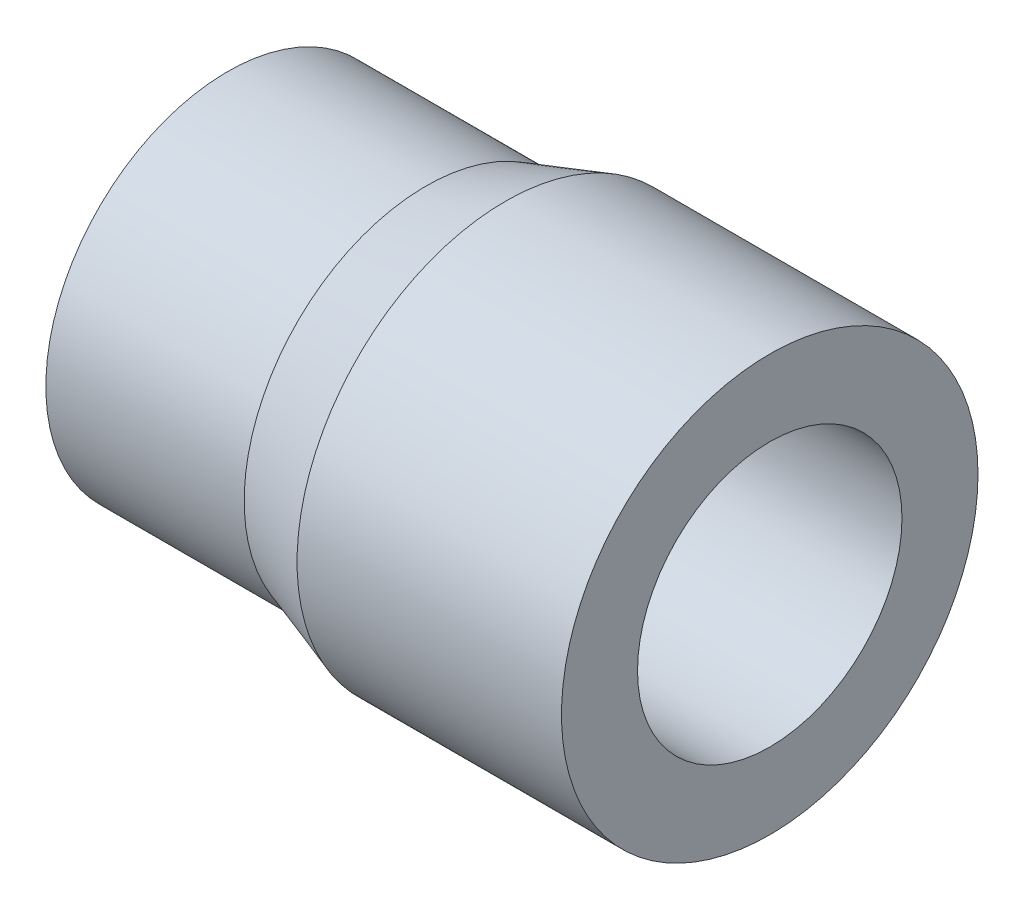
ISO-10303-21;
HEADER;
FILE_DESCRIPTION(('STEP AP214'),'2;1');
FILE_NAME('part.step','',(''),(''),'','','');
FILE_SCHEMA(('AUTOMOTIVE_DESIGN { 1 0 10303 214 1 1 1 1 }'));
ENDSEC;
DATA;
#1=APPLICATION_CONTEXT('core data for automotive mechanical design processes');
#2=APPLICATION_PROTOCOL_DEFINITION('international standard','automotive_design',2000,#1);
#3=PRODUCT_CONTEXT('',#1,'mechanical');
#4=PRODUCT('Part','Part','',(#3));
#5=PRODUCT_RELATED_PRODUCT_CATEGORY('part','',(#4));
#6=PRODUCT_DEFINITION_FORMATION('','',#4);
#7=PRODUCT_DEFINITION_CONTEXT('part definition',#1,'design');
#8=PRODUCT_DEFINITION('design','',#6,#7);
#9=PRODUCT_DEFINITION_SHAPE('','',#8);
#10=(LENGTH_UNIT() NAMED_UNIT(*) SI_UNIT(.MILLI.,.METRE.));
#11=(NAMED_UNIT(*) PLANE_ANGLE_UNIT() SI_UNIT($,.RADIAN.));
#12=(NAMED_UNIT(*) SI_UNIT($,.STERADIAN.) SOLID_ANGLE_UNIT());
#13=UNCERTAINTY_MEASURE_WITH_UNIT(LENGTH_MEASURE(1.E-05),#10,'distance_accuracy_value','');
#14=(GEOMETRIC_REPRESENTATION_CONTEXT(3) GLOBAL_UNCERTAINTY_ASSIGNED_CONTEXT((#13)) GLOBAL_UNIT_ASSIGNED_CONTEXT((#10,
#11,#12)) REPRESENTATION_CONTEXT('',''));
#15=CARTESIAN_POINT('',(0.,0.,0.));
#16=DIRECTION('',(0.,0.,1.));
#17=DIRECTION('',(1.,0.,0.));
#18=AXIS2_PLACEMENT_3D('',#15,#16,#17);
#19=CARTESIAN_POINT('',(0.,0.,0.));
#20=DIRECTION('',(1.,0.,0.));
#21=DIRECTION('',(0.,0.,-1.));
#22=AXIS2_PLACEMENT_3D('',#19,#20,#21);
#23=CYLINDRICAL_SURFACE('',#22,3.15);
#24=CARTESIAN_POINT('',(0.,0.,0.));
#25=DIRECTION('',(1.,0.,0.));
#26=DIRECTION('',(0.,0.,-1.));
#27=AXIS2_PLACEMENT_3D('',#24,#25,#26);
#28=CIRCLE('',#27,3.15);
#29=CARTESIAN_POINT('',(0.,0.,-3.15));
#30=VERTEX_POINT('',#29);
#31=EDGE_CURVE('E10',#30,#30,#28,.T.);
#32=ORIENTED_EDGE('',*,*,#31,.F.);
#33=EDGE_LOOP('',(#32));
#34=FACE_BOUND('',#33,.T.);
#35=CARTESIAN_POINT('',(-4.,0.,0.));
#36=DIRECTION('',(1.,0.,0.));
#37=DIRECTION('',(0.,0.,-1.));
#38=AXIS2_PLACEMENT_3D('',#35,#36,#37);
#39=CIRCLE('',#38,3.15);
#40=CARTESIAN_POINT('',(-4.,0.,-3.15));
#41=VERTEX_POINT('',#40);
#42=EDGE_CURVE('E59',#41,#41,#39,.T.);
#43=ORIENTED_EDGE('',*,*,#42,.T.);
#44=EDGE_LOOP('',(#43));
#45=FACE_BOUND('',#44,.T.);
#46=ADVANCED_FACE('F37',(#34,#45),#23,.T.);
#47=CARTESIAN_POINT('',(0.,0.,3.15));
#48=DIRECTION('',(-1.,0.,0.));
#49=DIRECTION('',(0.,0.,1.));
#50=AXIS2_PLACEMENT_3D('',#47,#48,#49);
#51=PLANE('',#50);
#52=CARTESIAN_POINT('',(0.,0.,0.));
#53=DIRECTION('',(1.,0.,0.));
#54=DIRECTION('',(0.,0.,-1.));
#55=AXIS2_PLACEMENT_3D('',#52,#53,#54);
#56=CIRCLE('',#55,2.);
#57=CARTESIAN_POINT('',(0.,0.,-2.));
#58=VERTEX_POINT('',#57);
#59=EDGE_CURVE('E43',#58,#58,#56,.T.);
#60=ORIENTED_EDGE('',*,*,#59,.F.);
#61=EDGE_LOOP('',(#60));
#62=FACE_BOUND('',#61,.T.);
#63=ORIENTED_EDGE('',*,*,#31,.T.);
#64=EDGE_LOOP('',(#63));
#65=FACE_BOUND('',#64,.T.);
#66=ADVANCED_FACE('F84',(#62,#65),#51,.F.);
#67=CARTESIAN_POINT('',(0.,0.,0.));
#68=DIRECTION('',(1.,0.,0.));
#69=DIRECTION('',(0.,0.,-1.));
#70=AXIS2_PLACEMENT_3D('',#67,#68,#69);
#71=CYLINDRICAL_SURFACE('',#70,2.);
#72=CARTESIAN_POINT('',(-8.2,0.,0.));
#73=DIRECTION('',(1.,0.,0.));
#74=DIRECTION('',(0.,0.,-1.));
#75=AXIS2_PLACEMENT_3D('',#72,#73,#74);
#76=CIRCLE('',#75,2.);
#77=CARTESIAN_POINT('',(-8.2,0.,-2.));
#78=VERTEX_POINT('',#77);
#79=EDGE_CURVE('E47',#78,#78,#76,.T.);
#80=ORIENTED_EDGE('',*,*,#79,.F.);
#81=EDGE_LOOP('',(#80));
#82=FACE_BOUND('',#81,.T.);
#83=ORIENTED_EDGE('',*,*,#59,.T.);
#84=EDGE_LOOP('',(#83));
#85=FACE_BOUND('',#84,.T.);
#86=ADVANCED_FACE('F79',(#82,#85),#71,.F.);
#87=CARTESIAN_POINT('',(-8.2,0.,2.));
#88=DIRECTION('',(1.,0.,0.));
#89=DIRECTION('',(0.,0.,-1.));
#90=AXIS2_PLACEMENT_3D('',#87,#88,#89);
#91=PLANE('',#90);
#92=CARTESIAN_POINT('',(-8.2,0.,0.));
#93=DIRECTION('',(1.,0.,0.));
#94=DIRECTION('',(0.,0.,-1.));
#95=AXIS2_PLACEMENT_3D('',#92,#93,#94);
#96=CIRCLE('',#95,2.75);
#97=CARTESIAN_POINT('',(-8.2,0.,-2.75));
#98=VERTEX_POINT('',#97);
#99=EDGE_CURVE('E51',#98,#98,#96,.T.);
#100=ORIENTED_EDGE('',*,*,#99,.F.);
#101=EDGE_LOOP('',(#100));
#102=FACE_BOUND('',#101,.T.);
#103=ORIENTED_EDGE('',*,*,#79,.T.);
#104=EDGE_LOOP('',(#103));
#105=FACE_BOUND('',#104,.T.);
#106=ADVANCED_FACE('F73',(#102,#105),#91,.F.);
#107=CARTESIAN_POINT('',(0.,0.,0.));
#108=DIRECTION('',(1.,0.,0.));
#109=DIRECTION('',(0.,0.,-1.));
#110=AXIS2_PLACEMENT_3D('',#107,#108,#109);
#111=CYLINDRICAL_SURFACE('',#110,2.75);
#112=CARTESIAN_POINT('',(-5.2,0.,0.));
#113=DIRECTION('',(1.,0.,0.));
#114=DIRECTION('',(0.,0.,-1.));
#115=AXIS2_PLACEMENT_3D('',#112,#113,#114);
#116=CIRCLE('',#115,2.75);
#117=CARTESIAN_POINT('',(-5.2,0.,-2.75));
#118=VERTEX_POINT('',#117);
#119=EDGE_CURVE('E56',#118,#118,#116,.T.);
#120=ORIENTED_EDGE('',*,*,#119,.F.);
#121=EDGE_LOOP('',(#120));
#122=FACE_BOUND('',#121,.T.);
#123=ORIENTED_EDGE('',*,*,#99,.T.);
#124=EDGE_LOOP('',(#123));
#125=FACE_BOUND('',#124,.T.);
#126=ADVANCED_FACE('F67',(#122,#125),#111,.T.);
#127=CARTESIAN_POINT('',(-5.2,0.,0.));
#128=DIRECTION('',(1.,0.,0.));
#129=DIRECTION('',(0.,0.,-1.));
#130=AXIS2_PLACEMENT_3D('',#127,#128,#129);
#131=CONICAL_SURFACE('',#130,2.75,0.321750554396643);
#132=ORIENTED_EDGE('',*,*,#42,.F.);
#133=EDGE_LOOP('',(#132));
#134=FACE_BOUND('',#133,.T.);
#135=ORIENTED_EDGE('',*,*,#119,.T.);
#136=EDGE_LOOP('',(#135));
#137=FACE_BOUND('',#136,.T.);
#138=ADVANCED_FACE('F64',(#134,#137),#131,.T.);
#139=CLOSED_SHELL('',(#46,#66,#86,#106,#126,#138));
#140=MANIFOLD_SOLID_BREP('B2',#139);
#141=ADVANCED_BREP_SHAPE_REPRESENTATION('',(#18,#140),#14);
#142=SHAPE_DEFINITION_REPRESENTATION(#9,#141);
ENDSEC;
END-ISO-10303-21;
